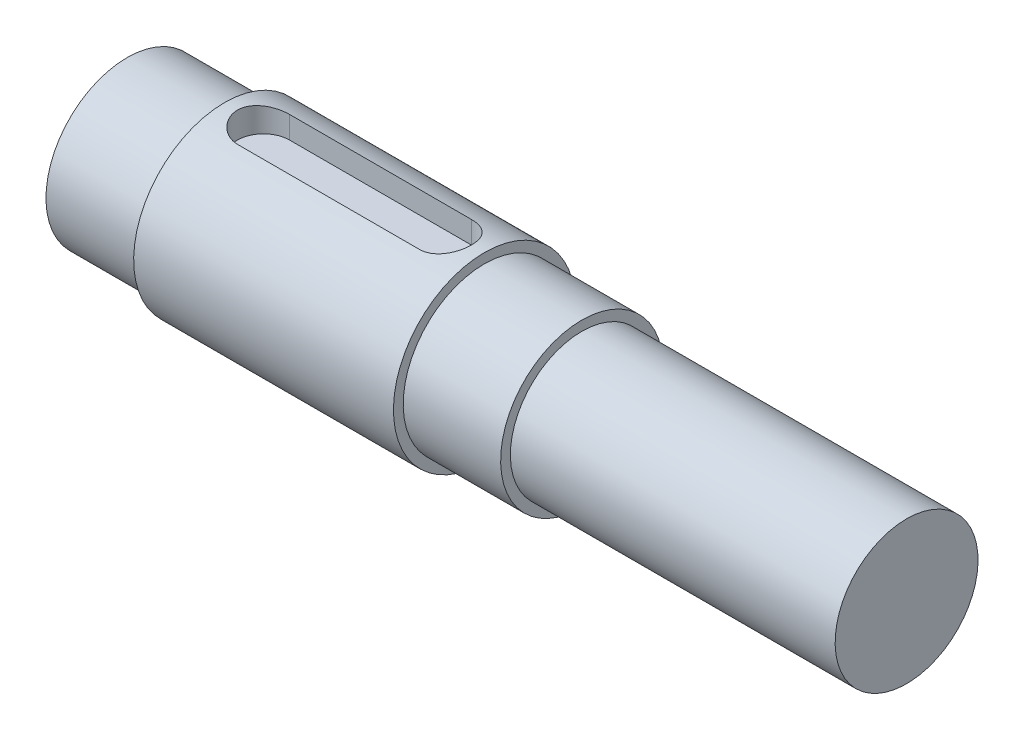
ISO-10303-21;
HEADER;
FILE_DESCRIPTION(('STEP AP214'),'2;1');
FILE_NAME('part.step','',(''),(''),'','','');
FILE_SCHEMA(('AUTOMOTIVE_DESIGN { 1 0 10303 214 1 1 1 1 }'));
ENDSEC;
DATA;
#1=APPLICATION_CONTEXT('core data for automotive mechanical design processes');
#2=APPLICATION_PROTOCOL_DEFINITION('international standard','automotive_design',2000,#1);
#3=PRODUCT_CONTEXT('',#1,'mechanical');
#4=PRODUCT('Part','Part','',(#3));
#5=PRODUCT_RELATED_PRODUCT_CATEGORY('part','',(#4));
#6=PRODUCT_DEFINITION_FORMATION('','',#4);
#7=PRODUCT_DEFINITION_CONTEXT('part definition',#1,'design');
#8=PRODUCT_DEFINITION('design','',#6,#7);
#9=PRODUCT_DEFINITION_SHAPE('','',#8);
#10=(LENGTH_UNIT() NAMED_UNIT(*) SI_UNIT(.MILLI.,.METRE.));
#11=(NAMED_UNIT(*) PLANE_ANGLE_UNIT() SI_UNIT($,.RADIAN.));
#12=(NAMED_UNIT(*) SI_UNIT($,.STERADIAN.) SOLID_ANGLE_UNIT());
#13=UNCERTAINTY_MEASURE_WITH_UNIT(LENGTH_MEASURE(1.E-05),#10,'distance_accuracy_value','');
#14=(GEOMETRIC_REPRESENTATION_CONTEXT(3) GLOBAL_UNCERTAINTY_ASSIGNED_CONTEXT((#13)) GLOBAL_UNIT_ASSIGNED_CONTEXT((#10,
#11,#12)) REPRESENTATION_CONTEXT('',''));
#15=CARTESIAN_POINT('',(0.,0.,0.));
#16=DIRECTION('',(0.,0.,1.));
#17=DIRECTION('',(1.,0.,0.));
#18=AXIS2_PLACEMENT_3D('',#15,#16,#17);
#19=CARTESIAN_POINT('',(120.,0.,0.));
#20=DIRECTION('',(1.,0.,0.));
#21=DIRECTION('',(0.,1.,0.));
#22=AXIS2_PLACEMENT_3D('',#19,#20,#21);
#23=CYLINDRICAL_SURFACE('',#22,14.);
#24=CARTESIAN_POINT('',(15.,0.,0.));
#25=DIRECTION('',(1.,0.,0.));
#26=DIRECTION('',(0.,1.,0.));
#27=AXIS2_PLACEMENT_3D('',#24,#25,#26);
#28=CIRCLE('',#27,14.);
#29=CARTESIAN_POINT('',(15.,14.,0.));
#30=VERTEX_POINT('',#29);
#31=EDGE_CURVE('E119',#30,#30,#28,.T.);
#32=ORIENTED_EDGE('',*,*,#31,.T.);
#33=EDGE_LOOP('',(#32));
#34=FACE_BOUND('',#33,.T.);
#35=CARTESIAN_POINT('',(55.,0.,0.));
#36=DIRECTION('',(1.,0.,0.));
#37=DIRECTION('',(0.,1.,0.));
#38=AXIS2_PLACEMENT_3D('',#35,#36,#37);
#39=CIRCLE('',#38,14.);
#40=CARTESIAN_POINT('',(55.,14.,0.));
#41=VERTEX_POINT('',#40);
#42=EDGE_CURVE('E116',#41,#41,#39,.T.);
#43=ORIENTED_EDGE('',*,*,#42,.F.);
#44=EDGE_LOOP('',(#43));
#45=FACE_BOUND('',#44,.T.);
#46=DIRECTION('',(1.,0.,0.));
#47=VECTOR('',#46,1.);
#48=CARTESIAN_POINT('',(120.,13.4164078649987,-4.));
#49=LINE('',#48,#47);
#50=CARTESIAN_POINT('',(21.,13.4164078649987,-4.));
#51=VERTEX_POINT('',#50);
#52=CARTESIAN_POINT('',(49.,13.4164078649987,-4.));
#53=VERTEX_POINT('',#52);
#54=EDGE_CURVE('E11',#51,#53,#49,.T.);
#55=ORIENTED_EDGE('',*,*,#54,.T.);
#56=CARTESIAN_POINT('',(49.,13.4164078649987,-4.));
#57=CARTESIAN_POINT('',(49.1100369382651,13.4163934343768,-4.00001343424814));
#58=CARTESIAN_POINT('',(49.2200654598724,13.417761265702,-3.99545969266927));
#59=CARTESIAN_POINT('',(49.439287989373,13.4231542734801,-3.97732232121695));
#60=CARTESIAN_POINT('',(49.5484821655647,13.4271788988993,-3.96374056379899));
#61=CARTESIAN_POINT('',(49.7650086825825,13.4377658850065,-3.92769415038321));
#62=CARTESIAN_POINT('',(49.8723448107536,13.4443222312205,-3.90525054417986));
#63=CARTESIAN_POINT('',(50.0846330025544,13.4597622573638,-3.85169716989989));
#64=CARTESIAN_POINT('',(50.1895850129441,13.4686459892105,-3.82058720849962));
#65=CARTESIAN_POINT('',(50.4997176429995,13.4984072106126,-3.71462722105447));
#66=CARTESIAN_POINT('',(50.7004324003075,13.5224082651875,-3.62710377190381));
#67=CARTESIAN_POINT('',(51.0843168620671,13.5760110031023,-3.42099335445292));
#68=CARTESIAN_POINT('',(51.267479405898,13.6056149576787,-3.30239378136284));
#69=CARTESIAN_POINT('',(51.6163694048883,13.6680345915526,-3.03385514387188));
#70=CARTESIAN_POINT('',(51.78152502006,13.7009134336833,-2.88318637668458));
#71=CARTESIAN_POINT('',(52.0846013559798,13.7656378360174,-2.55635049218508));
#72=CARTESIAN_POINT('',(52.2225175601809,13.7974832241344,-2.38017915468807));
#73=CARTESIAN_POINT('',(52.46965938831,13.8572672913436,-2.00328797864421));
#74=CARTESIAN_POINT('',(52.57830390558,13.885122326296,-1.80217262010785));
#75=CARTESIAN_POINT('',(52.7600070035731,13.9330517158678,-1.38360719231065));
#76=CARTESIAN_POINT('',(52.8330740946009,13.9531279309862,-1.16616104383812));
#77=CARTESIAN_POINT('',(52.9396683167644,13.9827902284191,-0.727119470413185));
#78=CARTESIAN_POINT('',(52.9741773114609,13.9926363331616,-0.505780313916722));
#79=CARTESIAN_POINT('',(53.0057735275053,14.0016419286283,-0.0602449633135598));
#80=CARTESIAN_POINT('',(53.0028671096311,14.0008032358133,0.163950738694264));
#81=CARTESIAN_POINT('',(52.9603871838748,13.9887201082301,0.601961495843512));
#82=CARTESIAN_POINT('',(52.9218765400541,13.9777773149303,0.815889248066122));
#83=CARTESIAN_POINT('',(52.8110088769656,13.9470775079522,1.23410663687489));
#84=CARTESIAN_POINT('',(52.7386501489513,13.9273200492871,1.43839578630406));
#85=CARTESIAN_POINT('',(52.5613811096927,13.8807804985663,1.83414901693189));
#86=CARTESIAN_POINT('',(52.4561231128314,13.8539238723959,2.02544821255193));
#87=CARTESIAN_POINT('',(52.216306263055,13.7960546774321,2.38801825135016));
#88=CARTESIAN_POINT('',(52.0817414630191,13.7650412656095,2.55928501856377));
#89=CARTESIAN_POINT('',(51.7816132030873,13.7009177251593,2.88324485398744));
#90=CARTESIAN_POINT('',(51.6151296674918,13.6677722027509,3.03507809124176));
#91=CARTESIAN_POINT('',(51.2585735571279,13.6040627781022,3.30897556854651));
#92=CARTESIAN_POINT('',(51.0684943152248,13.573499609643,3.43103136574905));
#93=CARTESIAN_POINT('',(50.7688413281017,13.5321405016799,3.58945338157003));
#94=CARTESIAN_POINT('',(50.6660101565672,13.5190503394636,3.63832313759783));
#95=CARTESIAN_POINT('',(50.4563737412823,13.4948216745023,3.72718558970198));
#96=CARTESIAN_POINT('',(50.3495701318666,13.4836823796704,3.767181890327));
#97=CARTESIAN_POINT('',(50.1328613347895,13.463719461374,3.83791732102717));
#98=CARTESIAN_POINT('',(50.0229595198012,13.4548934199316,3.86866612224974));
#99=CARTESIAN_POINT('',(49.8008040600392,13.4398293634308,3.92067829243348));
#100=CARTESIAN_POINT('',(49.6885515301646,13.4335901494402,3.9419460559715));
#101=CARTESIAN_POINT('',(49.4802677978619,13.4246640965205,3.97223001063663));
#102=CARTESIAN_POINT('',(49.3844546408757,13.4215735027143,3.98264484818434));
#103=CARTESIAN_POINT('',(49.1924302194045,13.4174428037393,3.99652828145244));
#104=CARTESIAN_POINT('',(49.096219787408,13.4163995712304,4.00000747148811));
#105=CARTESIAN_POINT('',(49.,13.4164078649987,4.));
#106=B_SPLINE_CURVE_WITH_KNOTS('',3,(#56,#57,#58,#59,#60,#61,#62,#63,#64,#65,#66,#67,#68,#69,
#70,#71,#72,#73,#74,#75,#76,#77,#78,#79,#80,#81,#82,#83,#84,#85,#86,#87,#88,#89,#90,#91,#92,#93,
#94,#95,#96,#97,#98,#99,#100,#101,#102,#103,#104,#105),.UNSPECIFIED.,.F.,.F.,(4,2,2,2,2,2,2,2,2,
2,2,2,2,2,2,2,2,2,2,2,2,2,2,2,4),(0.,0.329993743043637,0.659919065086394,0.989065375850017,
1.31821902959231,1.97575167696558,2.6335514401874,3.30832474645298,3.98320984263715,
4.67064278038706,5.35791119973408,6.02724874934373,6.69647251025092,7.34634193868018,
7.99624417788576,8.6532612048729,9.31041168231765,9.99056134493198,10.6709036279931,
11.0143588121194,11.357674222404,11.700629330619,12.0434253092463,12.3324405185763,
12.6210139131113),.UNSPECIFIED.);
#107=CARTESIAN_POINT('',(49.,13.4164078649987,4.));
#108=VERTEX_POINT('',#107);
#109=EDGE_CURVE('E49',#53,#108,#106,.T.);
#110=ORIENTED_EDGE('',*,*,#109,.T.);
#111=DIRECTION('',(1.,0.,0.));
#112=VECTOR('',#111,1.);
#113=CARTESIAN_POINT('',(120.,13.4164078649987,4.));
#114=LINE('',#113,#112);
#115=CARTESIAN_POINT('',(21.,13.4164078649987,4.));
#116=VERTEX_POINT('',#115);
#117=EDGE_CURVE('E135',#108,#116,#114,.F.);
#118=ORIENTED_EDGE('',*,*,#117,.T.);
#119=CARTESIAN_POINT('',(21.,13.4164078649987,4.));
#120=CARTESIAN_POINT('',(20.8899630617349,13.4163934343768,4.00001343424814));
#121=CARTESIAN_POINT('',(20.7799345401276,13.417761265702,3.99545969266927));
#122=CARTESIAN_POINT('',(20.560712010627,13.4231542734801,3.97732232121695));
#123=CARTESIAN_POINT('',(20.4515178344354,13.4271788988993,3.96374056379899));
#124=CARTESIAN_POINT('',(20.2349913174175,13.4377658850065,3.92769415038321));
#125=CARTESIAN_POINT('',(20.1276551892464,13.4443222312205,3.90525054417986));
#126=CARTESIAN_POINT('',(19.9153669974456,13.4597622573638,3.85169716989989));
#127=CARTESIAN_POINT('',(19.8104149870559,13.4686459892105,3.82058720849962));
#128=CARTESIAN_POINT('',(19.5002823570005,13.4984072106126,3.71462722105447));
#129=CARTESIAN_POINT('',(19.2995675996925,13.5224082651875,3.62710377190381));
#130=CARTESIAN_POINT('',(18.9156831379329,13.5760110031023,3.42099335445292));
#131=CARTESIAN_POINT('',(18.732520594102,13.6056149576787,3.30239378136283));
#132=CARTESIAN_POINT('',(18.3836305951117,13.6680345915526,3.03385514387187));
#133=CARTESIAN_POINT('',(18.21847497994,13.7009134336833,2.88318637668458));
#134=CARTESIAN_POINT('',(17.9153986440201,13.7656378360174,2.55635049218508));
#135=CARTESIAN_POINT('',(17.7774824398191,13.7974832241344,2.38017915468806));
#136=CARTESIAN_POINT('',(17.53034061169,13.8572672913436,2.00328797864421));
#137=CARTESIAN_POINT('',(17.42169609442,13.885122326296,1.80217262010785));
#138=CARTESIAN_POINT('',(17.2399929964269,13.9330517158678,1.38360719231065));
#139=CARTESIAN_POINT('',(17.1669259053991,13.9531279309862,1.16616104383813));
#140=CARTESIAN_POINT('',(17.0603316832356,13.9827902284191,0.727119470413191));
#141=CARTESIAN_POINT('',(17.0258226885391,13.9926363331616,0.505780313916727));
#142=CARTESIAN_POINT('',(16.9942264724947,14.0016419286283,0.0602449633135646));
#143=CARTESIAN_POINT('',(16.9971328903689,14.0008032358133,-0.163950738694261));
#144=CARTESIAN_POINT('',(17.0396128161252,13.9887201082301,-0.60196149584351));
#145=CARTESIAN_POINT('',(17.0781234599459,13.9777773149303,-0.81588924806612));
#146=CARTESIAN_POINT('',(17.1889911230344,13.9470775079522,-1.23410663687489));
#147=CARTESIAN_POINT('',(17.2613498510487,13.9273200492871,-1.43839578630405));
#148=CARTESIAN_POINT('',(17.4386188903073,13.8807804985663,-1.83414901693189));
#149=CARTESIAN_POINT('',(17.5438768871685,13.8539238723959,-2.02544821255193));
#150=CARTESIAN_POINT('',(17.783693736945,13.7960546774321,-2.38801825135016));
#151=CARTESIAN_POINT('',(17.9182585369809,13.7650412656095,-2.55928501856377));
#152=CARTESIAN_POINT('',(18.2183867969127,13.7009177251593,-2.88324485398744));
#153=CARTESIAN_POINT('',(18.3848703325082,13.6677722027509,-3.03507809124176));
#154=CARTESIAN_POINT('',(18.7414264428721,13.6040627781022,-3.30897556854652));
#155=CARTESIAN_POINT('',(18.9315056847752,13.573499609643,-3.43103136574905));
#156=CARTESIAN_POINT('',(19.2311586718983,13.5321405016799,-3.58945338157003));
#157=CARTESIAN_POINT('',(19.3339898434328,13.5190503394636,-3.63832313759783));
#158=CARTESIAN_POINT('',(19.5436262587177,13.4948216745023,-3.72718558970199));
#159=CARTESIAN_POINT('',(19.6504298681334,13.4836823796704,-3.767181890327));
#160=CARTESIAN_POINT('',(19.8671386652105,13.463719461374,-3.83791732102717));
#161=CARTESIAN_POINT('',(19.9770404801988,13.4548934199316,-3.86866612224974));
#162=CARTESIAN_POINT('',(20.1991959399608,13.4398293634308,-3.92067829243348));
#163=CARTESIAN_POINT('',(20.3114484698354,13.4335901494402,-3.9419460559715));
#164=CARTESIAN_POINT('',(20.5197322021381,13.4246640965205,-3.97223001063663));
#165=CARTESIAN_POINT('',(20.6155453591243,13.4215735027143,-3.98264484818434));
#166=CARTESIAN_POINT('',(20.8075697805955,13.4174428037393,-3.99652828145244));
#167=CARTESIAN_POINT('',(20.903780212592,13.4163995712304,-4.00000747148811));
#168=CARTESIAN_POINT('',(21.,13.4164078649987,-4.));
#169=B_SPLINE_CURVE_WITH_KNOTS('',3,(#119,#120,#121,#122,#123,#124,#125,#126,#127,#128,#129,
#130,#131,#132,#133,#134,#135,#136,#137,#138,#139,#140,#141,#142,#143,#144,#145,#146,#147,#148,
#149,#150,#151,#152,#153,#154,#155,#156,#157,#158,#159,#160,#161,#162,#163,#164,#165,#166,#167,
#168),.UNSPECIFIED.,.F.,.F.,(4,2,2,2,2,2,2,2,2,2,2,2,2,2,2,2,2,2,2,2,2,2,2,2,4),(0.,
0.329993743043637,0.659919065086383,0.989065375850014,1.31821902959231,1.97575167696558,
2.63355144018741,3.30832474645299,3.98320984263716,4.67064278038706,5.35791119973408,
6.02724874934373,6.69647251025092,7.34634193868018,7.99624417788575,8.65326120487289,
9.31041168231765,9.99056134493198,10.6709036279931,11.0143588121194,11.357674222404,
11.700629330619,12.0434253092463,12.3324405185763,12.6210139131113),.UNSPECIFIED.);
#170=EDGE_CURVE('E42',#116,#51,#169,.T.);
#171=ORIENTED_EDGE('',*,*,#170,.T.);
#172=EDGE_LOOP('',(#55,#110,#118,#171));
#173=FACE_BOUND('',#172,.T.);
#174=ADVANCED_FACE('F34',(#34,#45,#173),#23,.T.);
#175=CARTESIAN_POINT('',(0.,0.,0.));
#176=DIRECTION('',(-1.,0.,0.));
#177=DIRECTION('',(0.,-1.,0.));
#178=AXIS2_PLACEMENT_3D('',#175,#176,#177);
#179=PLANE('',#178);
#180=CARTESIAN_POINT('',(0.,0.,0.));
#181=DIRECTION('',(1.,0.,0.));
#182=DIRECTION('',(0.,1.,0.));
#183=AXIS2_PLACEMENT_3D('',#180,#181,#182);
#184=CIRCLE('',#183,12.5);
#185=CARTESIAN_POINT('',(0.,12.5,0.));
#186=VERTEX_POINT('',#185);
#187=EDGE_CURVE('E125',#186,#186,#184,.T.);
#188=ORIENTED_EDGE('',*,*,#187,.F.);
#189=EDGE_LOOP('',(#188));
#190=FACE_BOUND('',#189,.T.);
#191=ADVANCED_FACE('F36',(#190),#179,.T.);
#192=CARTESIAN_POINT('',(120.,0.,0.));
#193=DIRECTION('',(1.,0.,0.));
#194=DIRECTION('',(0.,1.,0.));
#195=AXIS2_PLACEMENT_3D('',#192,#193,#194);
#196=CYLINDRICAL_SURFACE('',#195,12.5);
#197=ORIENTED_EDGE('',*,*,#187,.T.);
#198=EDGE_LOOP('',(#197));
#199=FACE_BOUND('',#198,.T.);
#200=CARTESIAN_POINT('',(15.,0.,0.));
#201=DIRECTION('',(1.,0.,0.));
#202=DIRECTION('',(0.,1.,0.));
#203=AXIS2_PLACEMENT_3D('',#200,#201,#202);
#204=CIRCLE('',#203,12.5);
#205=CARTESIAN_POINT('',(15.,12.5,0.));
#206=VERTEX_POINT('',#205);
#207=EDGE_CURVE('E122',#206,#206,#204,.T.);
#208=ORIENTED_EDGE('',*,*,#207,.F.);
#209=EDGE_LOOP('',(#208));
#210=FACE_BOUND('',#209,.T.);
#211=ADVANCED_FACE('F168',(#199,#210),#196,.T.);
#212=CARTESIAN_POINT('',(15.,12.5,0.));
#213=DIRECTION('',(-1.,0.,0.));
#214=DIRECTION('',(0.,-1.,0.));
#215=AXIS2_PLACEMENT_3D('',#212,#213,#214);
#216=PLANE('',#215);
#217=ORIENTED_EDGE('',*,*,#207,.T.);
#218=EDGE_LOOP('',(#217));
#219=FACE_BOUND('',#218,.T.);
#220=ORIENTED_EDGE('',*,*,#31,.F.);
#221=EDGE_LOOP('',(#220));
#222=FACE_BOUND('',#221,.T.);
#223=ADVANCED_FACE('F178',(#219,#222),#216,.T.);
#224=CARTESIAN_POINT('',(55.,14.,0.));
#225=DIRECTION('',(1.,0.,0.));
#226=DIRECTION('',(0.,1.,0.));
#227=AXIS2_PLACEMENT_3D('',#224,#225,#226);
#228=PLANE('',#227);
#229=ORIENTED_EDGE('',*,*,#42,.T.);
#230=EDGE_LOOP('',(#229));
#231=FACE_BOUND('',#230,.T.);
#232=CARTESIAN_POINT('',(55.,0.,0.));
#233=DIRECTION('',(1.,0.,0.));
#234=DIRECTION('',(0.,1.,0.));
#235=AXIS2_PLACEMENT_3D('',#232,#233,#234);
#236=CIRCLE('',#235,12.5);
#237=CARTESIAN_POINT('',(55.,12.5,0.));
#238=VERTEX_POINT('',#237);
#239=EDGE_CURVE('E113',#238,#238,#236,.T.);
#240=ORIENTED_EDGE('',*,*,#239,.F.);
#241=EDGE_LOOP('',(#240));
#242=FACE_BOUND('',#241,.T.);
#243=ADVANCED_FACE('F174',(#231,#242),#228,.T.);
#244=CARTESIAN_POINT('',(120.,0.,0.));
#245=DIRECTION('',(1.,0.,0.));
#246=DIRECTION('',(0.,1.,0.));
#247=AXIS2_PLACEMENT_3D('',#244,#245,#246);
#248=CYLINDRICAL_SURFACE('',#247,12.5);
#249=ORIENTED_EDGE('',*,*,#239,.T.);
#250=EDGE_LOOP('',(#249));
#251=FACE_BOUND('',#250,.T.);
#252=CARTESIAN_POINT('',(70.,0.,0.));
#253=DIRECTION('',(1.,0.,0.));
#254=DIRECTION('',(0.,1.,0.));
#255=AXIS2_PLACEMENT_3D('',#252,#253,#254);
#256=CIRCLE('',#255,12.5);
#257=CARTESIAN_POINT('',(70.,12.5,0.));
#258=VERTEX_POINT('',#257);
#259=EDGE_CURVE('E110',#258,#258,#256,.T.);
#260=ORIENTED_EDGE('',*,*,#259,.F.);
#261=EDGE_LOOP('',(#260));
#262=FACE_BOUND('',#261,.T.);
#263=ADVANCED_FACE('F177',(#251,#262),#248,.T.);
#264=CARTESIAN_POINT('',(70.,12.5,0.));
#265=DIRECTION('',(1.,0.,0.));
#266=DIRECTION('',(0.,1.,0.));
#267=AXIS2_PLACEMENT_3D('',#264,#265,#266);
#268=PLANE('',#267);
#269=ORIENTED_EDGE('',*,*,#259,.T.);
#270=EDGE_LOOP('',(#269));
#271=FACE_BOUND('',#270,.T.);
#272=CARTESIAN_POINT('',(70.,0.,0.));
#273=DIRECTION('',(1.,0.,0.));
#274=DIRECTION('',(0.,1.,0.));
#275=AXIS2_PLACEMENT_3D('',#272,#273,#274);
#276=CIRCLE('',#275,11.);
#277=CARTESIAN_POINT('',(70.,11.,0.));
#278=VERTEX_POINT('',#277);
#279=EDGE_CURVE('E107',#278,#278,#276,.T.);
#280=ORIENTED_EDGE('',*,*,#279,.F.);
#281=EDGE_LOOP('',(#280));
#282=FACE_BOUND('',#281,.T.);
#283=ADVANCED_FACE('F183',(#271,#282),#268,.T.);
#284=CARTESIAN_POINT('',(120.,0.,0.));
#285=DIRECTION('',(1.,0.,0.));
#286=DIRECTION('',(0.,1.,0.));
#287=AXIS2_PLACEMENT_3D('',#284,#285,#286);
#288=CYLINDRICAL_SURFACE('',#287,11.);
#289=ORIENTED_EDGE('',*,*,#279,.T.);
#290=EDGE_LOOP('',(#289));
#291=FACE_BOUND('',#290,.T.);
#292=CARTESIAN_POINT('',(120.,0.,0.));
#293=DIRECTION('',(1.,0.,0.));
#294=DIRECTION('',(0.,1.,0.));
#295=AXIS2_PLACEMENT_3D('',#292,#293,#294);
#296=CIRCLE('',#295,11.);
#297=CARTESIAN_POINT('',(120.,11.,0.));
#298=VERTEX_POINT('',#297);
#299=EDGE_CURVE('E81',#298,#298,#296,.T.);
#300=ORIENTED_EDGE('',*,*,#299,.F.);
#301=EDGE_LOOP('',(#300));
#302=FACE_BOUND('',#301,.T.);
#303=ADVANCED_FACE('F189',(#291,#302),#288,.T.);
#304=CARTESIAN_POINT('',(120.,11.,0.));
#305=DIRECTION('',(1.,0.,0.));
#306=DIRECTION('',(0.,1.,0.));
#307=AXIS2_PLACEMENT_3D('',#304,#305,#306);
#308=PLANE('',#307);
#309=ORIENTED_EDGE('',*,*,#299,.T.);
#310=EDGE_LOOP('',(#309));
#311=FACE_BOUND('',#310,.T.);
#312=ADVANCED_FACE('F151',(#311),#308,.T.);
#313=CARTESIAN_POINT('',(21.,14.,0.));
#314=DIRECTION('',(0.,-1.,0.));
#315=DIRECTION('',(0.,0.,-1.));
#316=AXIS2_PLACEMENT_3D('',#313,#314,#315);
#317=CYLINDRICAL_SURFACE('',#316,4.);
#318=DIRECTION('',(0.,-1.,0.));
#319=VECTOR('',#318,1.);
#320=CARTESIAN_POINT('',(21.,14.,4.));
#321=LINE('',#320,#319);
#322=CARTESIAN_POINT('',(21.,10.,4.));
#323=VERTEX_POINT('',#322);
#324=EDGE_CURVE('E74',#116,#323,#321,.T.);
#325=ORIENTED_EDGE('',*,*,#324,.T.);
#326=CARTESIAN_POINT('',(21.,10.,0.));
#327=DIRECTION('',(0.,1.,0.));
#328=DIRECTION('',(0.,0.,1.));
#329=AXIS2_PLACEMENT_3D('',#326,#327,#328);
#330=CIRCLE('',#329,4.);
#331=CARTESIAN_POINT('',(21.,10.,-4.));
#332=VERTEX_POINT('',#331);
#333=EDGE_CURVE('E78',#332,#323,#330,.T.);
#334=ORIENTED_EDGE('',*,*,#333,.F.);
#335=DIRECTION('',(0.,-1.,0.));
#336=VECTOR('',#335,1.);
#337=CARTESIAN_POINT('',(21.,14.,-4.));
#338=LINE('',#337,#336);
#339=EDGE_CURVE('E100',#51,#332,#338,.T.);
#340=ORIENTED_EDGE('',*,*,#339,.F.);
#341=ORIENTED_EDGE('',*,*,#170,.F.);
#342=EDGE_LOOP('',(#325,#334,#340,#341));
#343=FACE_BOUND('',#342,.T.);
#344=ADVANCED_FACE('F76',(#343),#317,.F.);
#345=CARTESIAN_POINT('',(21.,14.,4.));
#346=DIRECTION('',(0.,0.,-1.));
#347=DIRECTION('',(-1.,0.,0.));
#348=AXIS2_PLACEMENT_3D('',#345,#346,#347);
#349=PLANE('',#348);
#350=DIRECTION('',(0.,-1.,0.));
#351=VECTOR('',#350,1.);
#352=CARTESIAN_POINT('',(49.,14.,4.));
#353=LINE('',#352,#351);
#354=CARTESIAN_POINT('',(49.,10.,4.));
#355=VERTEX_POINT('',#354);
#356=EDGE_CURVE('E82',#108,#355,#353,.T.);
#357=ORIENTED_EDGE('',*,*,#356,.T.);
#358=DIRECTION('',(1.,0.,0.));
#359=VECTOR('',#358,1.);
#360=CARTESIAN_POINT('',(21.,10.,4.));
#361=LINE('',#360,#359);
#362=EDGE_CURVE('E85',#323,#355,#361,.T.);
#363=ORIENTED_EDGE('',*,*,#362,.F.);
#364=ORIENTED_EDGE('',*,*,#324,.F.);
#365=ORIENTED_EDGE('',*,*,#117,.F.);
#366=EDGE_LOOP('',(#357,#363,#364,#365));
#367=FACE_BOUND('',#366,.T.);
#368=ADVANCED_FACE('F86',(#367),#349,.T.);
#369=CARTESIAN_POINT('',(49.,14.,0.));
#370=DIRECTION('',(0.,-1.,0.));
#371=DIRECTION('',(0.,0.,-1.));
#372=AXIS2_PLACEMENT_3D('',#369,#370,#371);
#373=CYLINDRICAL_SURFACE('',#372,4.);
#374=DIRECTION('',(0.,-1.,0.));
#375=VECTOR('',#374,1.);
#376=CARTESIAN_POINT('',(49.,14.,-4.));
#377=LINE('',#376,#375);
#378=CARTESIAN_POINT('',(49.,10.,-4.));
#379=VERTEX_POINT('',#378);
#380=EDGE_CURVE('E102',#53,#379,#377,.T.);
#381=ORIENTED_EDGE('',*,*,#380,.T.);
#382=CARTESIAN_POINT('',(49.,10.,0.));
#383=DIRECTION('',(0.,1.,0.));
#384=DIRECTION('',(0.,0.,1.));
#385=AXIS2_PLACEMENT_3D('',#382,#383,#384);
#386=CIRCLE('',#385,4.);
#387=EDGE_CURVE('E90',#355,#379,#386,.T.);
#388=ORIENTED_EDGE('',*,*,#387,.F.);
#389=ORIENTED_EDGE('',*,*,#356,.F.);
#390=ORIENTED_EDGE('',*,*,#109,.F.);
#391=EDGE_LOOP('',(#381,#388,#389,#390));
#392=FACE_BOUND('',#391,.T.);
#393=ADVANCED_FACE('F139',(#392),#373,.F.);
#394=CARTESIAN_POINT('',(21.,14.,-4.));
#395=DIRECTION('',(0.,0.,1.));
#396=DIRECTION('',(1.,0.,0.));
#397=AXIS2_PLACEMENT_3D('',#394,#395,#396);
#398=PLANE('',#397);
#399=ORIENTED_EDGE('',*,*,#339,.T.);
#400=DIRECTION('',(-1.,0.,0.));
#401=VECTOR('',#400,1.);
#402=CARTESIAN_POINT('',(21.,10.,-4.));
#403=LINE('',#402,#401);
#404=EDGE_CURVE('E95',#379,#332,#403,.T.);
#405=ORIENTED_EDGE('',*,*,#404,.F.);
#406=ORIENTED_EDGE('',*,*,#380,.F.);
#407=ORIENTED_EDGE('',*,*,#54,.F.);
#408=EDGE_LOOP('',(#399,#405,#406,#407));
#409=FACE_BOUND('',#408,.T.);
#410=ADVANCED_FACE('F144',(#409),#398,.T.);
#411=CARTESIAN_POINT('',(21.,10.,0.));
#412=DIRECTION('',(0.,1.,0.));
#413=DIRECTION('',(0.,0.,1.));
#414=AXIS2_PLACEMENT_3D('',#411,#412,#413);
#415=PLANE('',#414);
#416=ORIENTED_EDGE('',*,*,#333,.T.);
#417=ORIENTED_EDGE('',*,*,#362,.T.);
#418=ORIENTED_EDGE('',*,*,#387,.T.);
#419=ORIENTED_EDGE('',*,*,#404,.T.);
#420=EDGE_LOOP('',(#416,#417,#418,#419));
#421=FACE_BOUND('',#420,.T.);
#422=ADVANCED_FACE('F93',(#421),#415,.T.);
#423=CLOSED_SHELL('',(#174,#191,#211,#223,#243,#263,#283,#303,#312,#344,#368,#393,#410,#422));
#424=MANIFOLD_SOLID_BREP('B2',#423);
#425=ADVANCED_BREP_SHAPE_REPRESENTATION('',(#18,#424),#14);
#426=SHAPE_DEFINITION_REPRESENTATION(#9,#425);
ENDSEC;
END-ISO-10303-21;
